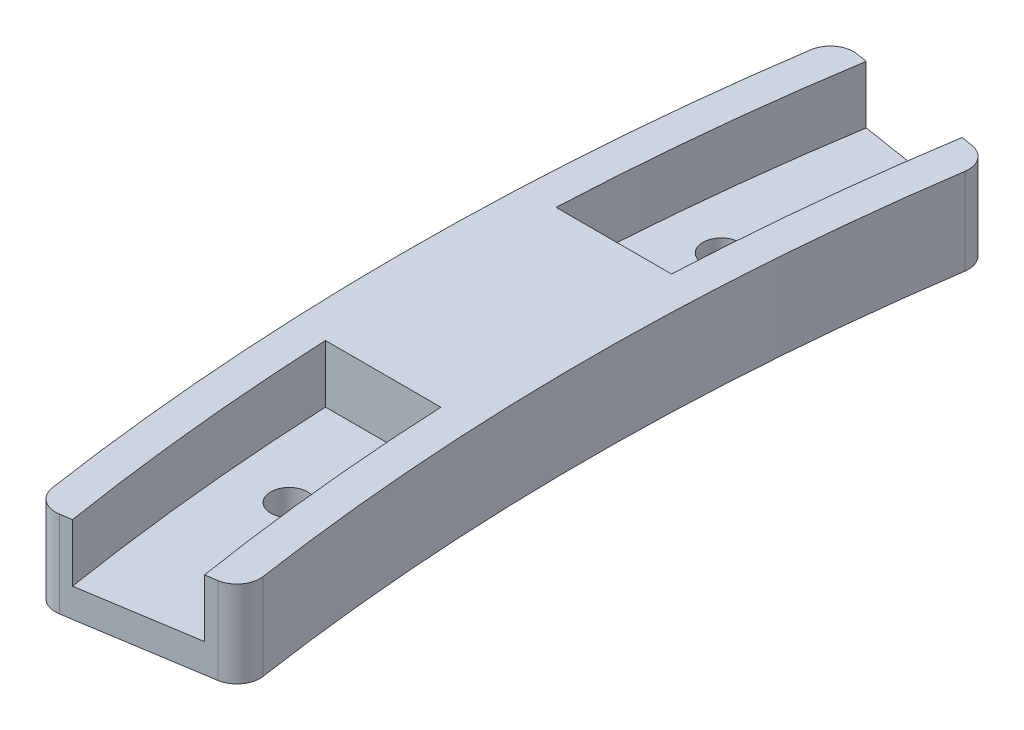
ISO-10303-21;
HEADER;
FILE_DESCRIPTION(('STEP AP214'),'2;1');
FILE_NAME('part.step','',(''),(''),'','','');
FILE_SCHEMA(('AUTOMOTIVE_DESIGN { 1 0 10303 214 1 1 1 1 }'));
ENDSEC;
DATA;
#1=APPLICATION_CONTEXT('core data for automotive mechanical design processes');
#2=APPLICATION_PROTOCOL_DEFINITION('international standard','automotive_design',2000,#1);
#3=PRODUCT_CONTEXT('',#1,'mechanical');
#4=PRODUCT('Part','Part','',(#3));
#5=PRODUCT_RELATED_PRODUCT_CATEGORY('part','',(#4));
#6=PRODUCT_DEFINITION_FORMATION('','',#4);
#7=PRODUCT_DEFINITION_CONTEXT('part definition',#1,'design');
#8=PRODUCT_DEFINITION('design','',#6,#7);
#9=PRODUCT_DEFINITION_SHAPE('','',#8);
#10=(LENGTH_UNIT() NAMED_UNIT(*) SI_UNIT(.MILLI.,.METRE.));
#11=(NAMED_UNIT(*) PLANE_ANGLE_UNIT() SI_UNIT($,.RADIAN.));
#12=(NAMED_UNIT(*) SI_UNIT($,.STERADIAN.) SOLID_ANGLE_UNIT());
#13=UNCERTAINTY_MEASURE_WITH_UNIT(LENGTH_MEASURE(1.E-05),#10,'distance_accuracy_value','');
#14=(GEOMETRIC_REPRESENTATION_CONTEXT(3) GLOBAL_UNCERTAINTY_ASSIGNED_CONTEXT((#13)) GLOBAL_UNIT_ASSIGNED_CONTEXT((#10,
#11,#12)) REPRESENTATION_CONTEXT('',''));
#15=CARTESIAN_POINT('',(0.,0.,0.));
#16=DIRECTION('',(0.,0.,1.));
#17=DIRECTION('',(1.,0.,0.));
#18=AXIS2_PLACEMENT_3D('',#15,#16,#17);
#19=CARTESIAN_POINT('',(0.,10.,0.));
#20=DIRECTION('',(0.156434465040234,0.,0.987688340595137));
#21=DIRECTION('',(0.987688340595137,0.,-0.156434465040234));
#22=AXIS2_PLACEMENT_3D('',#19,#20,#21);
#23=PLANE('',#22);
#24=DIRECTION('',(0.,1.,0.));
#25=VECTOR('',#24,1.);
#26=CARTESIAN_POINT('',(-218.270184732485,0.,34.5706010483885));
#27=LINE('',#26,#25);
#28=CARTESIAN_POINT('',(-218.270184732485,10.,34.5706010483885));
#29=VERTEX_POINT('',#28);
#30=CARTESIAN_POINT('',(-218.270184732485,2.5,34.5706010483885));
#31=VERTEX_POINT('',#30);
#32=EDGE_CURVE('E11',#29,#31,#27,.F.);
#33=ORIENTED_EDGE('',*,*,#32,.T.);
#34=DIRECTION('',(-0.987688340595137,0.,0.156434465040233));
#35=VECTOR('',#34,1.);
#36=CARTESIAN_POINT('',(-206.417411404929,2.5,32.6933061786099));
#37=LINE('',#36,#35);
#38=CARTESIAN_POINT('',(-206.417411404929,2.5,32.6933061786099));
#39=VERTEX_POINT('',#38);
#40=EDGE_CURVE('E157',#39,#31,#37,.T.);
#41=ORIENTED_EDGE('',*,*,#40,.F.);
#42=DIRECTION('',(0.,-1.,0.));
#43=VECTOR('',#42,1.);
#44=CARTESIAN_POINT('',(-206.417411404929,10.,32.6933061786099));
#45=LINE('',#44,#43);
#46=CARTESIAN_POINT('',(-206.417411404929,10.,32.6933061786099));
#47=VERTEX_POINT('',#46);
#48=EDGE_CURVE('E45',#39,#47,#45,.F.);
#49=ORIENTED_EDGE('',*,*,#48,.T.);
#50=DIRECTION('',(-0.987688340595137,0.,0.156434465040234));
#51=VECTOR('',#50,1.);
#52=CARTESIAN_POINT('',(0.,10.,0.));
#53=LINE('',#52,#51);
#54=CARTESIAN_POINT('',(-207.414551524979,10.,32.8512376584491));
#55=VERTEX_POINT('',#54);
#56=EDGE_CURVE('E200',#47,#55,#53,.T.);
#57=ORIENTED_EDGE('',*,*,#56,.T.);
#58=DIRECTION('',(0.,1.,0.));
#59=VECTOR('',#58,1.);
#60=CARTESIAN_POINT('',(-207.414551524979,5.,32.8512376584491));
#61=LINE('',#60,#59);
#62=CARTESIAN_POINT('',(-207.414551524979,5.,32.8512376584491));
#63=VERTEX_POINT('',#62);
#64=EDGE_CURVE('E251',#63,#55,#61,.T.);
#65=ORIENTED_EDGE('',*,*,#64,.F.);
#66=DIRECTION('',(0.987688340595137,0.,-0.156434465040234));
#67=VECTOR('',#66,1.);
#68=CARTESIAN_POINT('',(0.,5.,0.));
#69=LINE('',#68,#67);
#70=CARTESIAN_POINT('',(-217.29143493093,5.,34.4155823088514));
#71=VERTEX_POINT('',#70);
#72=EDGE_CURVE('E270',#71,#63,#69,.T.);
#73=ORIENTED_EDGE('',*,*,#72,.F.);
#74=DIRECTION('',(0.,1.,0.));
#75=VECTOR('',#74,1.);
#76=CARTESIAN_POINT('',(-217.29143493093,5.,34.4155823088514));
#77=LINE('',#76,#75);
#78=CARTESIAN_POINT('',(-217.29143493093,10.,34.4155823088514));
#79=VERTEX_POINT('',#78);
#80=EDGE_CURVE('E283',#71,#79,#77,.T.);
#81=ORIENTED_EDGE('',*,*,#80,.T.);
#82=EDGE_CURVE('E210',#79,#29,#53,.T.);
#83=ORIENTED_EDGE('',*,*,#82,.T.);
#84=EDGE_LOOP('',(#33,#41,#49,#57,#65,#73,#81,#83));
#85=FACE_BOUND('',#84,.T.);
#86=ADVANCED_FACE('F37',(#85),#23,.T.);
#87=CARTESIAN_POINT('',(0.,10.,0.));
#88=DIRECTION('',(0.156434465040234,0.,-0.987688340595137));
#89=DIRECTION('',(-0.987688340595137,0.,-0.156434465040234));
#90=AXIS2_PLACEMENT_3D('',#87,#88,#89);
#91=PLANE('',#90);
#92=DIRECTION('',(0.,-1.,0.));
#93=VECTOR('',#92,1.);
#94=CARTESIAN_POINT('',(-206.417411404929,10.,-32.6933061786099));
#95=LINE('',#94,#93);
#96=CARTESIAN_POINT('',(-206.417411404929,10.,-32.6933061786099));
#97=VERTEX_POINT('',#96);
#98=CARTESIAN_POINT('',(-206.417411404929,2.5,-32.6933061786099));
#99=VERTEX_POINT('',#98);
#100=EDGE_CURVE('E177',#97,#99,#95,.T.);
#101=ORIENTED_EDGE('',*,*,#100,.T.);
#102=DIRECTION('',(0.987688340595138,0.,0.156434465040232));
#103=VECTOR('',#102,1.);
#104=CARTESIAN_POINT('',(-218.270184732485,2.5,-34.5706010483885));
#105=LINE('',#104,#103);
#106=CARTESIAN_POINT('',(-218.270184732485,2.5,-34.5706010483884));
#107=VERTEX_POINT('',#106);
#108=EDGE_CURVE('E506',#107,#99,#105,.T.);
#109=ORIENTED_EDGE('',*,*,#108,.F.);
#110=DIRECTION('',(0.,1.,0.));
#111=VECTOR('',#110,1.);
#112=CARTESIAN_POINT('',(-218.270184732485,10.,-34.5706010483885));
#113=LINE('',#112,#111);
#114=CARTESIAN_POINT('',(-218.270184732485,10.,-34.5706010483885));
#115=VERTEX_POINT('',#114);
#116=EDGE_CURVE('E185',#107,#115,#113,.T.);
#117=ORIENTED_EDGE('',*,*,#116,.T.);
#118=DIRECTION('',(0.987688340595137,0.,0.156434465040234));
#119=VECTOR('',#118,1.);
#120=CARTESIAN_POINT('',(0.,10.,0.));
#121=LINE('',#120,#119);
#122=CARTESIAN_POINT('',(-217.29143493093,10.,-34.4155823088514));
#123=VERTEX_POINT('',#122);
#124=EDGE_CURVE('E179',#115,#123,#121,.T.);
#125=ORIENTED_EDGE('',*,*,#124,.T.);
#126=DIRECTION('',(0.,1.,0.));
#127=VECTOR('',#126,1.);
#128=CARTESIAN_POINT('',(-217.291434930931,5.,-34.4155823088515));
#129=LINE('',#128,#127);
#130=CARTESIAN_POINT('',(-217.291434930931,5.,-34.4155823088515));
#131=VERTEX_POINT('',#130);
#132=EDGE_CURVE('E227',#131,#123,#129,.T.);
#133=ORIENTED_EDGE('',*,*,#132,.F.);
#134=DIRECTION('',(-0.987688340595137,0.,-0.156434465040234));
#135=VECTOR('',#134,1.);
#136=CARTESIAN_POINT('',(0.,5.,0.));
#137=LINE('',#136,#135);
#138=CARTESIAN_POINT('',(-207.414551524979,5.,-32.8512376584492));
#139=VERTEX_POINT('',#138);
#140=EDGE_CURVE('E257',#139,#131,#137,.T.);
#141=ORIENTED_EDGE('',*,*,#140,.F.);
#142=DIRECTION('',(0.,1.,0.));
#143=VECTOR('',#142,1.);
#144=CARTESIAN_POINT('',(-207.414551524979,5.,-32.8512376584492));
#145=LINE('',#144,#143);
#146=CARTESIAN_POINT('',(-207.414551524979,10.,-32.8512376584492));
#147=VERTEX_POINT('',#146);
#148=EDGE_CURVE('E258',#139,#147,#145,.T.);
#149=ORIENTED_EDGE('',*,*,#148,.T.);
#150=EDGE_CURVE('E218',#147,#97,#121,.T.);
#151=ORIENTED_EDGE('',*,*,#150,.T.);
#152=EDGE_LOOP('',(#101,#109,#117,#125,#133,#141,#149,#151));
#153=FACE_BOUND('',#152,.T.);
#154=ADVANCED_FACE('F225',(#153),#91,.T.);
#155=CARTESIAN_POINT('',(0.,10.,0.));
#156=DIRECTION('',(0.,-1.,0.));
#157=DIRECTION('',(0.,0.,-1.));
#158=AXIS2_PLACEMENT_3D('',#155,#156,#157);
#159=CYLINDRICAL_SURFACE('',#158,207.);
#160=DIRECTION('',(0.,-1.,0.));
#161=VECTOR('',#160,1.);
#162=CARTESIAN_POINT('',(-204.752000140416,10.,30.4239780189754));
#163=LINE('',#162,#161);
#164=CARTESIAN_POINT('',(-204.752000140416,10.,30.4239780189754));
#165=VERTEX_POINT('',#164);
#166=CARTESIAN_POINT('',(-204.752000140416,2.5,30.4239780189754));
#167=VERTEX_POINT('',#166);
#168=EDGE_CURVE('E193',#165,#167,#163,.T.);
#169=ORIENTED_EDGE('',*,*,#168,.T.);
#170=CARTESIAN_POINT('',(0.,2.5,0.));
#171=DIRECTION('',(0.,1.,0.));
#172=DIRECTION('',(0.,0.,-1.));
#173=AXIS2_PLACEMENT_3D('',#170,#171,#172);
#174=CIRCLE('',#173,207.);
#175=CARTESIAN_POINT('',(-204.752000140416,2.5,-30.4239780189754));
#176=VERTEX_POINT('',#175);
#177=EDGE_CURVE('E52',#176,#167,#174,.T.);
#178=ORIENTED_EDGE('',*,*,#177,.F.);
#179=DIRECTION('',(0.,-1.,0.));
#180=VECTOR('',#179,1.);
#181=CARTESIAN_POINT('',(-204.752000140416,10.,-30.4239780189754));
#182=LINE('',#181,#180);
#183=CARTESIAN_POINT('',(-204.752000140416,10.,-30.4239780189754));
#184=VERTEX_POINT('',#183);
#185=EDGE_CURVE('E196',#176,#184,#182,.F.);
#186=ORIENTED_EDGE('',*,*,#185,.T.);
#187=CARTESIAN_POINT('',(0.,10.,0.));
#188=DIRECTION('',(0.,1.,0.));
#189=DIRECTION('',(0.,0.,1.));
#190=AXIS2_PLACEMENT_3D('',#187,#188,#189);
#191=CIRCLE('',#190,207.);
#192=EDGE_CURVE('E209',#184,#165,#191,.T.);
#193=ORIENTED_EDGE('',*,*,#192,.T.);
#194=EDGE_LOOP('',(#169,#178,#186,#193));
#195=FACE_BOUND('',#194,.T.);
#196=ADVANCED_FACE('F215',(#195),#159,.F.);
#197=CARTESIAN_POINT('',(0.,10.,0.));
#198=DIRECTION('',(0.,-1.,0.));
#199=DIRECTION('',(0.,0.,-1.));
#200=AXIS2_PLACEMENT_3D('',#197,#198,#199);
#201=CYLINDRICAL_SURFACE('',#200,223.);
#202=CARTESIAN_POINT('',(0.,2.5,0.));
#203=DIRECTION('',(0.,-1.,0.));
#204=DIRECTION('',(0.,0.,-1.));
#205=AXIS2_PLACEMENT_3D('',#202,#203,#204);
#206=CIRCLE('',#205,223.);
#207=CARTESIAN_POINT('',(-220.561180845032,2.5,32.8902037732363));
#208=VERTEX_POINT('',#207);
#209=CARTESIAN_POINT('',(-220.561180845032,2.5,-32.890203773236));
#210=VERTEX_POINT('',#209);
#211=EDGE_CURVE('E154',#208,#210,#206,.T.);
#212=ORIENTED_EDGE('',*,*,#211,.F.);
#213=DIRECTION('',(0.,-1.,0.));
#214=VECTOR('',#213,1.);
#215=CARTESIAN_POINT('',(-220.561180845032,10.,32.8902037732362));
#216=LINE('',#215,#214);
#217=CARTESIAN_POINT('',(-220.561180845032,10.,32.8902037732362));
#218=VERTEX_POINT('',#217);
#219=EDGE_CURVE('E166',#208,#218,#216,.F.);
#220=ORIENTED_EDGE('',*,*,#219,.T.);
#221=CARTESIAN_POINT('',(0.,10.,0.));
#222=DIRECTION('',(0.,1.,0.));
#223=DIRECTION('',(0.,0.,1.));
#224=AXIS2_PLACEMENT_3D('',#221,#222,#223);
#225=CIRCLE('',#224,223.);
#226=CARTESIAN_POINT('',(-220.561180845032,10.,-32.8902037732362));
#227=VERTEX_POINT('',#226);
#228=EDGE_CURVE('E175',#227,#218,#225,.T.);
#229=ORIENTED_EDGE('',*,*,#228,.F.);
#230=DIRECTION('',(0.,-1.,0.));
#231=VECTOR('',#230,1.);
#232=CARTESIAN_POINT('',(-220.561180845032,10.,-32.8902037732362));
#233=LINE('',#232,#231);
#234=EDGE_CURVE('E169',#227,#210,#233,.T.);
#235=ORIENTED_EDGE('',*,*,#234,.T.);
#236=EDGE_LOOP('',(#212,#220,#229,#235));
#237=FACE_BOUND('',#236,.T.);
#238=ADVANCED_FACE('F164',(#237),#201,.T.);
#239=CARTESIAN_POINT('',(-214.181860089725,0.,-18.7384846907465));
#240=DIRECTION('',(0.,-1.,0.));
#241=DIRECTION('',(0.,0.,-1.));
#242=AXIS2_PLACEMENT_3D('',#239,#240,#241);
#243=CYLINDRICAL_SURFACE('',#242,1.59999999999999);
#244=CARTESIAN_POINT('',(-214.181860089725,5.,-18.7384846907465));
#245=DIRECTION('',(0.,1.,0.));
#246=DIRECTION('',(0.,0.,1.));
#247=AXIS2_PLACEMENT_3D('',#244,#245,#246);
#248=CIRCLE('',#247,1.59999999999999);
#249=CARTESIAN_POINT('',(-214.181860089725,5.,-17.1384846907465));
#250=VERTEX_POINT('',#249);
#251=EDGE_CURVE('E279',#250,#250,#248,.T.);
#252=ORIENTED_EDGE('',*,*,#251,.T.);
#253=EDGE_LOOP('',(#252));
#254=FACE_BOUND('',#253,.T.);
#255=CARTESIAN_POINT('',(-214.181860089725,2.5,-18.7384846907465));
#256=DIRECTION('',(0.,-1.,0.));
#257=DIRECTION('',(0.,0.,-1.));
#258=AXIS2_PLACEMENT_3D('',#255,#256,#257);
#259=CIRCLE('',#258,1.59999999999999);
#260=CARTESIAN_POINT('',(-214.181860089725,2.5,-20.3384846907465));
#261=VERTEX_POINT('',#260);
#262=EDGE_CURVE('E486',#261,#261,#259,.F.);
#263=ORIENTED_EDGE('',*,*,#262,.F.);
#264=EDGE_LOOP('',(#263));
#265=FACE_BOUND('',#264,.T.);
#266=ADVANCED_FACE('F338',(#254,#265),#243,.F.);
#267=CARTESIAN_POINT('',(-214.181860089725,0.,18.7384846907466));
#268=DIRECTION('',(0.,-1.,0.));
#269=DIRECTION('',(0.,0.,-1.));
#270=AXIS2_PLACEMENT_3D('',#267,#268,#269);
#271=CYLINDRICAL_SURFACE('',#270,1.59999999999999);
#272=CARTESIAN_POINT('',(-214.181860089725,5.,18.7384846907466));
#273=DIRECTION('',(0.,1.,0.));
#274=DIRECTION('',(0.,0.,1.));
#275=AXIS2_PLACEMENT_3D('',#272,#273,#274);
#276=CIRCLE('',#275,1.59999999999999);
#277=CARTESIAN_POINT('',(-214.181860089725,5.,20.3384846907466));
#278=VERTEX_POINT('',#277);
#279=EDGE_CURVE('E482',#278,#278,#276,.T.);
#280=ORIENTED_EDGE('',*,*,#279,.T.);
#281=EDGE_LOOP('',(#280));
#282=FACE_BOUND('',#281,.T.);
#283=CARTESIAN_POINT('',(-214.181860089725,2.5,18.7384846907466));
#284=DIRECTION('',(0.,-1.,0.));
#285=DIRECTION('',(0.,0.,-1.));
#286=AXIS2_PLACEMENT_3D('',#283,#284,#285);
#287=CIRCLE('',#286,1.59999999999999);
#288=CARTESIAN_POINT('',(-214.181860089725,2.5,17.1384846907466));
#289=VERTEX_POINT('',#288);
#290=EDGE_CURVE('E485',#289,#289,#287,.F.);
#291=ORIENTED_EDGE('',*,*,#290,.F.);
#292=EDGE_LOOP('',(#291));
#293=FACE_BOUND('',#292,.T.);
#294=ADVANCED_FACE('F322',(#282,#293),#271,.F.);
#295=CARTESIAN_POINT('',(-218.583053662566,10.,-32.5952243671982));
#296=DIRECTION('',(0.,-1.,0.));
#297=DIRECTION('',(0.,0.,-1.));
#298=AXIS2_PLACEMENT_3D('',#295,#296,#297);
#299=CYLINDRICAL_SURFACE('',#298,2.);
#300=ORIENTED_EDGE('',*,*,#116,.F.);
#301=CARTESIAN_POINT('',(-218.583053662566,2.5,-32.5952243671982));
#302=DIRECTION('',(0.,-1.,0.));
#303=DIRECTION('',(0.,0.,-1.));
#304=AXIS2_PLACEMENT_3D('',#301,#302,#303);
#305=CIRCLE('',#304,1.99999999999997);
#306=EDGE_CURVE('E170',#210,#107,#305,.T.);
#307=ORIENTED_EDGE('',*,*,#306,.F.);
#308=ORIENTED_EDGE('',*,*,#234,.F.);
#309=CARTESIAN_POINT('',(-218.583053662566,10.,-32.5952243671982));
#310=DIRECTION('',(0.,1.,0.));
#311=DIRECTION('',(0.,0.,1.));
#312=AXIS2_PLACEMENT_3D('',#309,#310,#311);
#313=CIRCLE('',#312,2.);
#314=EDGE_CURVE('E191',#115,#227,#313,.T.);
#315=ORIENTED_EDGE('',*,*,#314,.F.);
#316=EDGE_LOOP('',(#300,#307,#308,#315));
#317=FACE_BOUND('',#316,.T.);
#318=ADVANCED_FACE('F318',(#317),#299,.T.);
#319=CARTESIAN_POINT('',(-206.730280335009,10.,-30.7179294974196));
#320=DIRECTION('',(0.,-1.,0.));
#321=DIRECTION('',(0.,0.,-1.));
#322=AXIS2_PLACEMENT_3D('',#319,#320,#321);
#323=CYLINDRICAL_SURFACE('',#322,2.);
#324=ORIENTED_EDGE('',*,*,#185,.F.);
#325=CARTESIAN_POINT('',(-206.730280335009,2.5,-30.7179294974196));
#326=DIRECTION('',(0.,-1.,0.));
#327=DIRECTION('',(0.,0.,-1.));
#328=AXIS2_PLACEMENT_3D('',#325,#326,#327);
#329=CIRCLE('',#328,2.00000000000002);
#330=EDGE_CURVE('E505',#99,#176,#329,.T.);
#331=ORIENTED_EDGE('',*,*,#330,.F.);
#332=ORIENTED_EDGE('',*,*,#100,.F.);
#333=CARTESIAN_POINT('',(-206.730280335009,10.,-30.7179294974196));
#334=DIRECTION('',(0.,1.,0.));
#335=DIRECTION('',(0.,0.,1.));
#336=AXIS2_PLACEMENT_3D('',#333,#334,#335);
#337=CIRCLE('',#336,2.);
#338=EDGE_CURVE('E189',#184,#97,#337,.T.);
#339=ORIENTED_EDGE('',*,*,#338,.F.);
#340=EDGE_LOOP('',(#324,#331,#332,#339));
#341=FACE_BOUND('',#340,.T.);
#342=ADVANCED_FACE('F321',(#341),#323,.T.);
#343=CARTESIAN_POINT('',(-218.583053662566,10.,32.5952243671982));
#344=DIRECTION('',(0.,-1.,0.));
#345=DIRECTION('',(0.,0.,-1.));
#346=AXIS2_PLACEMENT_3D('',#343,#344,#345);
#347=CYLINDRICAL_SURFACE('',#346,2.);
#348=ORIENTED_EDGE('',*,*,#219,.F.);
#349=CARTESIAN_POINT('',(-218.583053662566,2.5,32.5952243671982));
#350=DIRECTION('',(0.,-1.,0.));
#351=DIRECTION('',(0.,0.,-1.));
#352=AXIS2_PLACEMENT_3D('',#349,#350,#351);
#353=CIRCLE('',#352,1.99999999999998);
#354=EDGE_CURVE('E150',#31,#208,#353,.T.);
#355=ORIENTED_EDGE('',*,*,#354,.F.);
#356=ORIENTED_EDGE('',*,*,#32,.F.);
#357=CARTESIAN_POINT('',(-218.583053662566,10.,32.5952243671982));
#358=DIRECTION('',(0.,1.,0.));
#359=DIRECTION('',(0.,0.,1.));
#360=AXIS2_PLACEMENT_3D('',#357,#358,#359);
#361=CIRCLE('',#360,2.);
#362=EDGE_CURVE('E174',#218,#29,#361,.T.);
#363=ORIENTED_EDGE('',*,*,#362,.F.);
#364=EDGE_LOOP('',(#348,#355,#356,#363));
#365=FACE_BOUND('',#364,.T.);
#366=ADVANCED_FACE('F173',(#365),#347,.T.);
#367=CARTESIAN_POINT('',(-206.730280335009,10.,30.7179294974196));
#368=DIRECTION('',(0.,-1.,0.));
#369=DIRECTION('',(0.,0.,-1.));
#370=AXIS2_PLACEMENT_3D('',#367,#368,#369);
#371=CYLINDRICAL_SURFACE('',#370,2.);
#372=ORIENTED_EDGE('',*,*,#48,.F.);
#373=CARTESIAN_POINT('',(-206.730280335009,2.5,30.7179294974196));
#374=DIRECTION('',(0.,-1.,0.));
#375=DIRECTION('',(0.,0.,-1.));
#376=AXIS2_PLACEMENT_3D('',#373,#374,#375);
#377=CIRCLE('',#376,2.00000000000004);
#378=EDGE_CURVE('E213',#167,#39,#377,.T.);
#379=ORIENTED_EDGE('',*,*,#378,.F.);
#380=ORIENTED_EDGE('',*,*,#168,.F.);
#381=CARTESIAN_POINT('',(-206.730280335009,10.,30.7179294974196));
#382=DIRECTION('',(0.,1.,0.));
#383=DIRECTION('',(0.,0.,1.));
#384=AXIS2_PLACEMENT_3D('',#381,#382,#383);
#385=CIRCLE('',#384,2.);
#386=EDGE_CURVE('E60',#47,#165,#385,.T.);
#387=ORIENTED_EDGE('',*,*,#386,.F.);
#388=EDGE_LOOP('',(#372,#379,#380,#387));
#389=FACE_BOUND('',#388,.T.);
#390=ADVANCED_FACE('F39',(#389),#371,.T.);
#391=CARTESIAN_POINT('',(0.,10.,0.));
#392=DIRECTION('',(0.,1.,0.));
#393=DIRECTION('',(0.,0.,1.));
#394=AXIS2_PLACEMENT_3D('',#391,#392,#393);
#395=PLANE('',#394);
#396=ORIENTED_EDGE('',*,*,#124,.F.);
#397=ORIENTED_EDGE('',*,*,#314,.T.);
#398=ORIENTED_EDGE('',*,*,#228,.T.);
#399=ORIENTED_EDGE('',*,*,#362,.T.);
#400=ORIENTED_EDGE('',*,*,#82,.F.);
#401=CARTESIAN_POINT('',(0.,10.,0.));
#402=DIRECTION('',(0.,1.,0.));
#403=DIRECTION('',(0.,0.,1.));
#404=AXIS2_PLACEMENT_3D('',#401,#402,#403);
#405=CIRCLE('',#404,220.);
#406=CARTESIAN_POINT('',(-219.772609758359,10.,10.));
#407=VERTEX_POINT('',#406);
#408=EDGE_CURVE('E278',#407,#79,#405,.T.);
#409=ORIENTED_EDGE('',*,*,#408,.F.);
#410=DIRECTION('',(-1.,0.,0.));
#411=VECTOR('',#410,1.);
#412=CARTESIAN_POINT('',(0.,10.,10.));
#413=LINE('',#412,#411);
#414=CARTESIAN_POINT('',(-209.76176963403,10.,10.));
#415=VERTEX_POINT('',#414);
#416=EDGE_CURVE('E276',#415,#407,#413,.T.);
#417=ORIENTED_EDGE('',*,*,#416,.F.);
#418=CARTESIAN_POINT('',(0.,10.,0.));
#419=DIRECTION('',(0.,1.,0.));
#420=DIRECTION('',(0.,0.,1.));
#421=AXIS2_PLACEMENT_3D('',#418,#419,#420);
#422=CIRCLE('',#421,210.);
#423=EDGE_CURVE('E208',#415,#55,#422,.T.);
#424=ORIENTED_EDGE('',*,*,#423,.T.);
#425=ORIENTED_EDGE('',*,*,#56,.F.);
#426=ORIENTED_EDGE('',*,*,#386,.T.);
#427=ORIENTED_EDGE('',*,*,#192,.F.);
#428=ORIENTED_EDGE('',*,*,#338,.T.);
#429=ORIENTED_EDGE('',*,*,#150,.F.);
#430=CARTESIAN_POINT('',(0.,10.,0.));
#431=DIRECTION('',(0.,1.,0.));
#432=DIRECTION('',(0.,0.,1.));
#433=AXIS2_PLACEMENT_3D('',#430,#431,#432);
#434=CIRCLE('',#433,210.);
#435=CARTESIAN_POINT('',(-209.76176963403,10.,-9.99999999999997));
#436=VERTEX_POINT('',#435);
#437=EDGE_CURVE('E249',#147,#436,#434,.T.);
#438=ORIENTED_EDGE('',*,*,#437,.T.);
#439=DIRECTION('',(-1.,0.,0.));
#440=VECTOR('',#439,1.);
#441=CARTESIAN_POINT('',(0.,10.,-9.99999999999997));
#442=LINE('',#441,#440);
#443=CARTESIAN_POINT('',(-219.772609758359,10.,-9.99999999999997));
#444=VERTEX_POINT('',#443);
#445=EDGE_CURVE('E246',#436,#444,#442,.T.);
#446=ORIENTED_EDGE('',*,*,#445,.T.);
#447=CARTESIAN_POINT('',(0.,10.,0.));
#448=DIRECTION('',(0.,1.,0.));
#449=DIRECTION('',(0.,0.,1.));
#450=AXIS2_PLACEMENT_3D('',#447,#448,#449);
#451=CIRCLE('',#450,220.);
#452=EDGE_CURVE('E236',#123,#444,#451,.T.);
#453=ORIENTED_EDGE('',*,*,#452,.F.);
#454=EDGE_LOOP('',(#396,#397,#398,#399,#400,#409,#417,#424,#425,#426,#427,#428,#429,#438,#446,#453));
#455=FACE_BOUND('',#454,.T.);
#456=ADVANCED_FACE('F205',(#455),#395,.T.);
#457=CARTESIAN_POINT('',(0.,5.,10.));
#458=DIRECTION('',(0.,0.,-1.));
#459=DIRECTION('',(-1.,0.,0.));
#460=AXIS2_PLACEMENT_3D('',#457,#458,#459);
#461=PLANE('',#460);
#462=ORIENTED_EDGE('',*,*,#416,.T.);
#463=DIRECTION('',(0.,1.,0.));
#464=VECTOR('',#463,1.);
#465=CARTESIAN_POINT('',(-219.772609758359,5.,10.));
#466=LINE('',#465,#464);
#467=CARTESIAN_POINT('',(-219.772609758359,5.,10.));
#468=VERTEX_POINT('',#467);
#469=EDGE_CURVE('E275',#468,#407,#466,.T.);
#470=ORIENTED_EDGE('',*,*,#469,.F.);
#471=DIRECTION('',(-1.,0.,0.));
#472=VECTOR('',#471,1.);
#473=CARTESIAN_POINT('',(0.,5.,10.));
#474=LINE('',#473,#472);
#475=CARTESIAN_POINT('',(-209.76176963403,5.,10.));
#476=VERTEX_POINT('',#475);
#477=EDGE_CURVE('E264',#476,#468,#474,.T.);
#478=ORIENTED_EDGE('',*,*,#477,.F.);
#479=DIRECTION('',(0.,1.,0.));
#480=VECTOR('',#479,1.);
#481=CARTESIAN_POINT('',(-209.76176963403,5.,10.));
#482=LINE('',#481,#480);
#483=EDGE_CURVE('E247',#476,#415,#482,.T.);
#484=ORIENTED_EDGE('',*,*,#483,.T.);
#485=EDGE_LOOP('',(#462,#470,#478,#484));
#486=FACE_BOUND('',#485,.T.);
#487=ADVANCED_FACE('F298',(#486),#461,.F.);
#488=CARTESIAN_POINT('',(0.,5.,0.));
#489=DIRECTION('',(0.,1.,0.));
#490=DIRECTION('',(0.,0.,1.));
#491=AXIS2_PLACEMENT_3D('',#488,#489,#490);
#492=CYLINDRICAL_SURFACE('',#491,210.);
#493=ORIENTED_EDGE('',*,*,#423,.F.);
#494=ORIENTED_EDGE('',*,*,#483,.F.);
#495=CARTESIAN_POINT('',(0.,5.,0.));
#496=DIRECTION('',(0.,1.,0.));
#497=DIRECTION('',(0.,0.,1.));
#498=AXIS2_PLACEMENT_3D('',#495,#496,#497);
#499=CIRCLE('',#498,210.);
#500=EDGE_CURVE('E273',#476,#63,#499,.T.);
#501=ORIENTED_EDGE('',*,*,#500,.T.);
#502=ORIENTED_EDGE('',*,*,#64,.T.);
#503=EDGE_LOOP('',(#493,#494,#501,#502));
#504=FACE_BOUND('',#503,.T.);
#505=ADVANCED_FACE('F300',(#504),#492,.T.);
#506=CARTESIAN_POINT('',(0.,5.,0.));
#507=DIRECTION('',(0.,1.,0.));
#508=DIRECTION('',(0.,0.,1.));
#509=AXIS2_PLACEMENT_3D('',#506,#507,#508);
#510=CYLINDRICAL_SURFACE('',#509,220.);
#511=ORIENTED_EDGE('',*,*,#408,.T.);
#512=ORIENTED_EDGE('',*,*,#80,.F.);
#513=CARTESIAN_POINT('',(0.,5.,0.));
#514=DIRECTION('',(0.,1.,0.));
#515=DIRECTION('',(0.,0.,1.));
#516=AXIS2_PLACEMENT_3D('',#513,#514,#515);
#517=CIRCLE('',#516,220.);
#518=EDGE_CURVE('E267',#468,#71,#517,.T.);
#519=ORIENTED_EDGE('',*,*,#518,.F.);
#520=ORIENTED_EDGE('',*,*,#469,.T.);
#521=EDGE_LOOP('',(#511,#512,#519,#520));
#522=FACE_BOUND('',#521,.T.);
#523=ADVANCED_FACE('F289',(#522),#510,.F.);
#524=CARTESIAN_POINT('',(0.,5.,0.));
#525=DIRECTION('',(0.,1.,0.));
#526=DIRECTION('',(0.,0.,1.));
#527=AXIS2_PLACEMENT_3D('',#524,#525,#526);
#528=PLANE('',#527);
#529=ORIENTED_EDGE('',*,*,#279,.F.);
#530=EDGE_LOOP('',(#529));
#531=FACE_BOUND('',#530,.T.);
#532=ORIENTED_EDGE('',*,*,#477,.T.);
#533=ORIENTED_EDGE('',*,*,#518,.T.);
#534=ORIENTED_EDGE('',*,*,#72,.T.);
#535=ORIENTED_EDGE('',*,*,#500,.F.);
#536=EDGE_LOOP('',(#532,#533,#534,#535));
#537=FACE_BOUND('',#536,.T.);
#538=ADVANCED_FACE('F296',(#531,#537),#528,.T.);
#539=CARTESIAN_POINT('',(0.,5.,0.));
#540=DIRECTION('',(0.,1.,0.));
#541=DIRECTION('',(0.,0.,1.));
#542=AXIS2_PLACEMENT_3D('',#539,#540,#541);
#543=CYLINDRICAL_SURFACE('',#542,210.);
#544=ORIENTED_EDGE('',*,*,#437,.F.);
#545=ORIENTED_EDGE('',*,*,#148,.F.);
#546=CARTESIAN_POINT('',(0.,5.,0.));
#547=DIRECTION('',(0.,1.,0.));
#548=DIRECTION('',(0.,0.,1.));
#549=AXIS2_PLACEMENT_3D('',#546,#547,#548);
#550=CIRCLE('',#549,210.);
#551=CARTESIAN_POINT('',(-209.76176963403,5.,-9.99999999999997));
#552=VERTEX_POINT('',#551);
#553=EDGE_CURVE('E242',#139,#552,#550,.T.);
#554=ORIENTED_EDGE('',*,*,#553,.T.);
#555=DIRECTION('',(0.,1.,0.));
#556=VECTOR('',#555,1.);
#557=CARTESIAN_POINT('',(-209.76176963403,5.,-9.99999999999997));
#558=LINE('',#557,#556);
#559=EDGE_CURVE('E261',#552,#436,#558,.T.);
#560=ORIENTED_EDGE('',*,*,#559,.T.);
#561=EDGE_LOOP('',(#544,#545,#554,#560));
#562=FACE_BOUND('',#561,.T.);
#563=ADVANCED_FACE('F387',(#562),#543,.T.);
#564=CARTESIAN_POINT('',(0.,5.,-9.99999999999997));
#565=DIRECTION('',(0.,0.,-1.));
#566=DIRECTION('',(-1.,0.,0.));
#567=AXIS2_PLACEMENT_3D('',#564,#565,#566);
#568=PLANE('',#567);
#569=ORIENTED_EDGE('',*,*,#445,.F.);
#570=ORIENTED_EDGE('',*,*,#559,.F.);
#571=DIRECTION('',(-1.,0.,0.));
#572=VECTOR('',#571,1.);
#573=CARTESIAN_POINT('',(0.,5.,-9.99999999999997));
#574=LINE('',#573,#572);
#575=CARTESIAN_POINT('',(-219.772609758359,5.,-9.99999999999997));
#576=VERTEX_POINT('',#575);
#577=EDGE_CURVE('E497',#552,#576,#574,.T.);
#578=ORIENTED_EDGE('',*,*,#577,.T.);
#579=DIRECTION('',(0.,1.,0.));
#580=VECTOR('',#579,1.);
#581=CARTESIAN_POINT('',(-219.772609758359,5.,-9.99999999999997));
#582=LINE('',#581,#580);
#583=EDGE_CURVE('E241',#576,#444,#582,.T.);
#584=ORIENTED_EDGE('',*,*,#583,.T.);
#585=EDGE_LOOP('',(#569,#570,#578,#584));
#586=FACE_BOUND('',#585,.T.);
#587=ADVANCED_FACE('F397',(#586),#568,.T.);
#588=CARTESIAN_POINT('',(0.,5.,0.));
#589=DIRECTION('',(0.,1.,0.));
#590=DIRECTION('',(0.,0.,1.));
#591=AXIS2_PLACEMENT_3D('',#588,#589,#590);
#592=CYLINDRICAL_SURFACE('',#591,220.);
#593=ORIENTED_EDGE('',*,*,#452,.T.);
#594=ORIENTED_EDGE('',*,*,#583,.F.);
#595=CARTESIAN_POINT('',(0.,5.,0.));
#596=DIRECTION('',(0.,1.,0.));
#597=DIRECTION('',(0.,0.,1.));
#598=AXIS2_PLACEMENT_3D('',#595,#596,#597);
#599=CIRCLE('',#598,220.);
#600=EDGE_CURVE('E239',#131,#576,#599,.T.);
#601=ORIENTED_EDGE('',*,*,#600,.F.);
#602=ORIENTED_EDGE('',*,*,#132,.T.);
#603=EDGE_LOOP('',(#593,#594,#601,#602));
#604=FACE_BOUND('',#603,.T.);
#605=ADVANCED_FACE('F234',(#604),#592,.F.);
#606=CARTESIAN_POINT('',(0.,5.,0.));
#607=DIRECTION('',(0.,1.,0.));
#608=DIRECTION('',(0.,0.,1.));
#609=AXIS2_PLACEMENT_3D('',#606,#607,#608);
#610=PLANE('',#609);
#611=ORIENTED_EDGE('',*,*,#251,.F.);
#612=EDGE_LOOP('',(#611));
#613=FACE_BOUND('',#612,.T.);
#614=ORIENTED_EDGE('',*,*,#140,.T.);
#615=ORIENTED_EDGE('',*,*,#600,.T.);
#616=ORIENTED_EDGE('',*,*,#577,.F.);
#617=ORIENTED_EDGE('',*,*,#553,.F.);
#618=EDGE_LOOP('',(#614,#615,#616,#617));
#619=FACE_BOUND('',#618,.T.);
#620=ADVANCED_FACE('F369',(#613,#619),#610,.T.);
#621=CARTESIAN_POINT('',(-218.583053662566,2.5,32.5952243671982));
#622=DIRECTION('',(0.,-1.,0.));
#623=DIRECTION('',(0.,0.,-1.));
#624=AXIS2_PLACEMENT_3D('',#621,#622,#623);
#625=PLANE('',#624);
#626=ORIENTED_EDGE('',*,*,#354,.T.);
#627=ORIENTED_EDGE('',*,*,#211,.T.);
#628=ORIENTED_EDGE('',*,*,#306,.T.);
#629=ORIENTED_EDGE('',*,*,#108,.T.);
#630=ORIENTED_EDGE('',*,*,#330,.T.);
#631=ORIENTED_EDGE('',*,*,#177,.T.);
#632=ORIENTED_EDGE('',*,*,#378,.T.);
#633=ORIENTED_EDGE('',*,*,#40,.T.);
#634=EDGE_LOOP('',(#626,#627,#628,#629,#630,#631,#632,#633));
#635=FACE_BOUND('',#634,.T.);
#636=ORIENTED_EDGE('',*,*,#290,.T.);
#637=EDGE_LOOP('',(#636));
#638=FACE_BOUND('',#637,.T.);
#639=ORIENTED_EDGE('',*,*,#262,.T.);
#640=EDGE_LOOP('',(#639));
#641=FACE_BOUND('',#640,.T.);
#642=ADVANCED_FACE('F152',(#635,#638,#641),#625,.T.);
#643=CLOSED_SHELL('',(#86,#154,#196,#238,#266,#294,#318,#342,#366,#390,#456,#487,#505,#523,#538,
#563,#587,#605,#620,#642));
#644=MANIFOLD_SOLID_BREP('B2',#643);
#645=ADVANCED_BREP_SHAPE_REPRESENTATION('',(#18,#644),#14);
#646=SHAPE_DEFINITION_REPRESENTATION(#9,#645);
ENDSEC;
END-ISO-10303-21;
